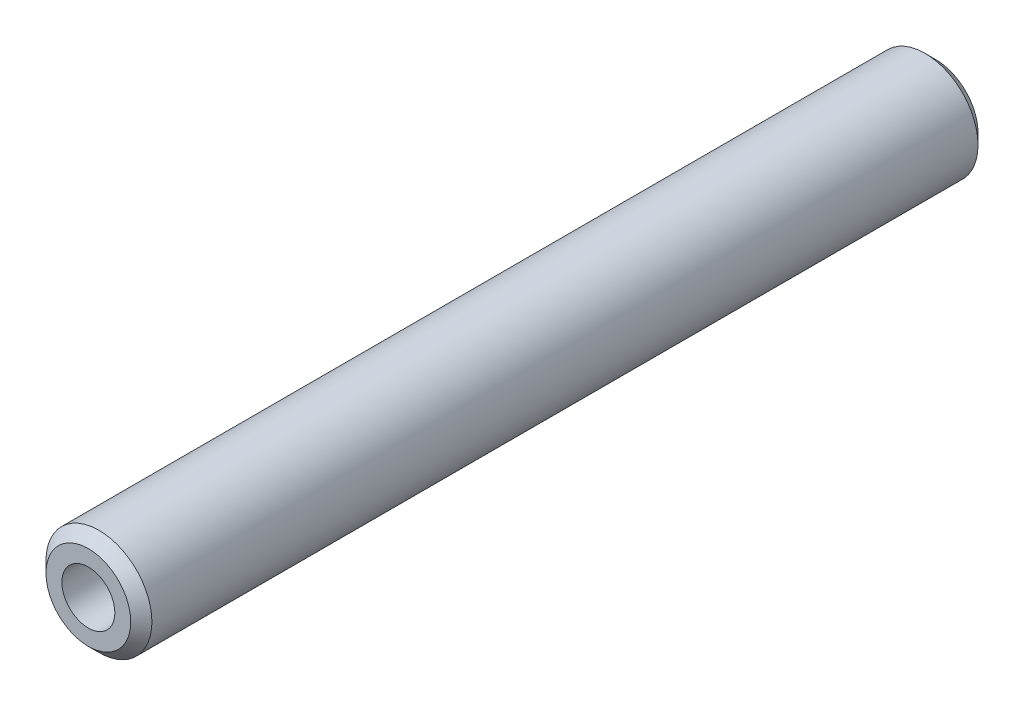
ISO-10303-21;
HEADER;
FILE_DESCRIPTION(('STEP AP214'),'2;1');
FILE_NAME('part.step','',(''),(''),'','','');
FILE_SCHEMA(('AUTOMOTIVE_DESIGN { 1 0 10303 214 1 1 1 1 }'));
ENDSEC;
DATA;
#1=APPLICATION_CONTEXT('core data for automotive mechanical design processes');
#2=APPLICATION_PROTOCOL_DEFINITION('international standard','automotive_design',2000,#1);
#3=PRODUCT_CONTEXT('',#1,'mechanical');
#4=PRODUCT('Part','Part','',(#3));
#5=PRODUCT_RELATED_PRODUCT_CATEGORY('part','',(#4));
#6=PRODUCT_DEFINITION_FORMATION('','',#4);
#7=PRODUCT_DEFINITION_CONTEXT('part definition',#1,'design');
#8=PRODUCT_DEFINITION('design','',#6,#7);
#9=PRODUCT_DEFINITION_SHAPE('','',#8);
#10=(LENGTH_UNIT() NAMED_UNIT(*) SI_UNIT(.MILLI.,.METRE.));
#11=(NAMED_UNIT(*) PLANE_ANGLE_UNIT() SI_UNIT($,.RADIAN.));
#12=(NAMED_UNIT(*) SI_UNIT($,.STERADIAN.) SOLID_ANGLE_UNIT());
#13=UNCERTAINTY_MEASURE_WITH_UNIT(LENGTH_MEASURE(1.E-05),#10,'distance_accuracy_value','');
#14=(GEOMETRIC_REPRESENTATION_CONTEXT(3) GLOBAL_UNCERTAINTY_ASSIGNED_CONTEXT((#13)) GLOBAL_UNIT_ASSIGNED_CONTEXT((#10,
#11,#12)) REPRESENTATION_CONTEXT('',''));
#15=CARTESIAN_POINT('',(0.,0.,0.));
#16=DIRECTION('',(0.,0.,1.));
#17=DIRECTION('',(1.,0.,0.));
#18=AXIS2_PLACEMENT_3D('',#15,#16,#17);
#19=CARTESIAN_POINT('',(0.,0.,20.));
#20=DIRECTION('',(0.,0.,-1.));
#21=DIRECTION('',(-1.,0.,0.));
#22=AXIS2_PLACEMENT_3D('',#19,#20,#21);
#23=CYLINDRICAL_SURFACE('',#22,2.5);
#24=CARTESIAN_POINT('',(0.,0.,-19.5));
#25=DIRECTION('',(0.,0.,1.));
#26=DIRECTION('',(1.,0.,0.));
#27=AXIS2_PLACEMENT_3D('',#24,#25,#26);
#28=CIRCLE('',#27,2.5);
#29=CARTESIAN_POINT('',(2.5,0.,-19.5));
#30=VERTEX_POINT('',#29);
#31=EDGE_CURVE('E65',#30,#30,#28,.T.);
#32=ORIENTED_EDGE('',*,*,#31,.T.);
#33=EDGE_LOOP('',(#32));
#34=FACE_BOUND('',#33,.T.);
#35=CARTESIAN_POINT('',(0.,0.,19.5));
#36=DIRECTION('',(0.,0.,1.));
#37=DIRECTION('',(1.,0.,0.));
#38=AXIS2_PLACEMENT_3D('',#35,#36,#37);
#39=CIRCLE('',#38,2.5);
#40=CARTESIAN_POINT('',(2.5,0.,19.5));
#41=VERTEX_POINT('',#40);
#42=EDGE_CURVE('E70',#41,#41,#39,.F.);
#43=ORIENTED_EDGE('',*,*,#42,.T.);
#44=EDGE_LOOP('',(#43));
#45=FACE_BOUND('',#44,.T.);
#46=ADVANCED_FACE('F51',(#34,#45),#23,.T.);
#47=CARTESIAN_POINT('',(0.,0.,20.));
#48=DIRECTION('',(0.,0.,1.));
#49=DIRECTION('',(1.,0.,0.));
#50=AXIS2_PLACEMENT_3D('',#47,#48,#49);
#51=PLANE('',#50);
#52=CARTESIAN_POINT('',(0.,0.,20.));
#53=DIRECTION('',(0.,0.,1.));
#54=DIRECTION('',(1.,0.,0.));
#55=AXIS2_PLACEMENT_3D('',#52,#53,#54);
#56=CIRCLE('',#55,2.);
#57=CARTESIAN_POINT('',(2.,0.,20.));
#58=VERTEX_POINT('',#57);
#59=EDGE_CURVE('E10',#58,#58,#56,.T.);
#60=ORIENTED_EDGE('',*,*,#59,.T.);
#61=EDGE_LOOP('',(#60));
#62=FACE_BOUND('',#61,.T.);
#63=CARTESIAN_POINT('',(0.,0.,20.));
#64=DIRECTION('',(0.,0.,1.));
#65=DIRECTION('',(1.,0.,0.));
#66=AXIS2_PLACEMENT_3D('',#63,#64,#65);
#67=CIRCLE('',#66,1.25);
#68=CARTESIAN_POINT('',(1.25,0.,20.));
#69=VERTEX_POINT('',#68);
#70=EDGE_CURVE('E80',#69,#69,#67,.T.);
#71=ORIENTED_EDGE('',*,*,#70,.F.);
#72=EDGE_LOOP('',(#71));
#73=FACE_BOUND('',#72,.T.);
#74=ADVANCED_FACE('F87',(#62,#73),#51,.T.);
#75=CARTESIAN_POINT('',(0.,0.,-20.));
#76=DIRECTION('',(0.,0.,1.));
#77=DIRECTION('',(1.,0.,0.));
#78=AXIS2_PLACEMENT_3D('',#75,#76,#77);
#79=PLANE('',#78);
#80=CARTESIAN_POINT('',(0.,0.,-20.));
#81=DIRECTION('',(0.,0.,1.));
#82=DIRECTION('',(1.,0.,0.));
#83=AXIS2_PLACEMENT_3D('',#80,#81,#82);
#84=CIRCLE('',#83,1.99999999999998);
#85=CARTESIAN_POINT('',(1.99999999999998,0.,-20.));
#86=VERTEX_POINT('',#85);
#87=EDGE_CURVE('E60',#86,#86,#84,.F.);
#88=ORIENTED_EDGE('',*,*,#87,.T.);
#89=EDGE_LOOP('',(#88));
#90=FACE_BOUND('',#89,.T.);
#91=CARTESIAN_POINT('',(0.,0.,-20.));
#92=DIRECTION('',(0.,0.,1.));
#93=DIRECTION('',(1.,0.,0.));
#94=AXIS2_PLACEMENT_3D('',#91,#92,#93);
#95=CIRCLE('',#94,1.24999999999999);
#96=CARTESIAN_POINT('',(1.24999999999999,0.,-20.));
#97=VERTEX_POINT('',#96);
#98=EDGE_CURVE('E76',#97,#97,#95,.T.);
#99=ORIENTED_EDGE('',*,*,#98,.T.);
#100=EDGE_LOOP('',(#99));
#101=FACE_BOUND('',#100,.T.);
#102=ADVANCED_FACE('F89',(#90,#101),#79,.F.);
#103=CARTESIAN_POINT('',(0.,0.,20.));
#104=DIRECTION('',(0.,0.,1.));
#105=DIRECTION('',(1.,0.,0.));
#106=AXIS2_PLACEMENT_3D('',#103,#104,#105);
#107=CYLINDRICAL_SURFACE('',#106,1.25);
#108=ORIENTED_EDGE('',*,*,#98,.F.);
#109=EDGE_LOOP('',(#108));
#110=FACE_BOUND('',#109,.T.);
#111=ORIENTED_EDGE('',*,*,#70,.T.);
#112=EDGE_LOOP('',(#111));
#113=FACE_BOUND('',#112,.T.);
#114=ADVANCED_FACE('F85',(#110,#113),#107,.F.);
#115=CARTESIAN_POINT('',(0.,0.,-19.5));
#116=DIRECTION('',(0.,0.,1.));
#117=DIRECTION('',(1.,0.,0.));
#118=AXIS2_PLACEMENT_3D('',#115,#116,#117);
#119=CONICAL_SURFACE('',#118,2.5,0.78539816339745);
#120=ORIENTED_EDGE('',*,*,#87,.F.);
#121=EDGE_LOOP('',(#120));
#122=FACE_BOUND('',#121,.T.);
#123=ORIENTED_EDGE('',*,*,#31,.F.);
#124=EDGE_LOOP('',(#123));
#125=FACE_BOUND('',#124,.T.);
#126=ADVANCED_FACE('F100',(#122,#125),#119,.T.);
#127=CARTESIAN_POINT('',(0.,0.,20.));
#128=DIRECTION('',(0.,0.,-1.));
#129=DIRECTION('',(-1.,0.,0.));
#130=AXIS2_PLACEMENT_3D('',#127,#128,#129);
#131=CONICAL_SURFACE('',#130,2.,0.785398163397446);
#132=ORIENTED_EDGE('',*,*,#42,.F.);
#133=EDGE_LOOP('',(#132));
#134=FACE_BOUND('',#133,.T.);
#135=ORIENTED_EDGE('',*,*,#59,.F.);
#136=EDGE_LOOP('',(#135));
#137=FACE_BOUND('',#136,.T.);
#138=ADVANCED_FACE('F54',(#134,#137),#131,.T.);
#139=CLOSED_SHELL('',(#46,#74,#102,#114,#126,#138));
#140=MANIFOLD_SOLID_BREP('B2',#139);
#141=ADVANCED_BREP_SHAPE_REPRESENTATION('',(#18,#140),#14);
#142=SHAPE_DEFINITION_REPRESENTATION(#9,#141);
ENDSEC;
END-ISO-10303-21;
